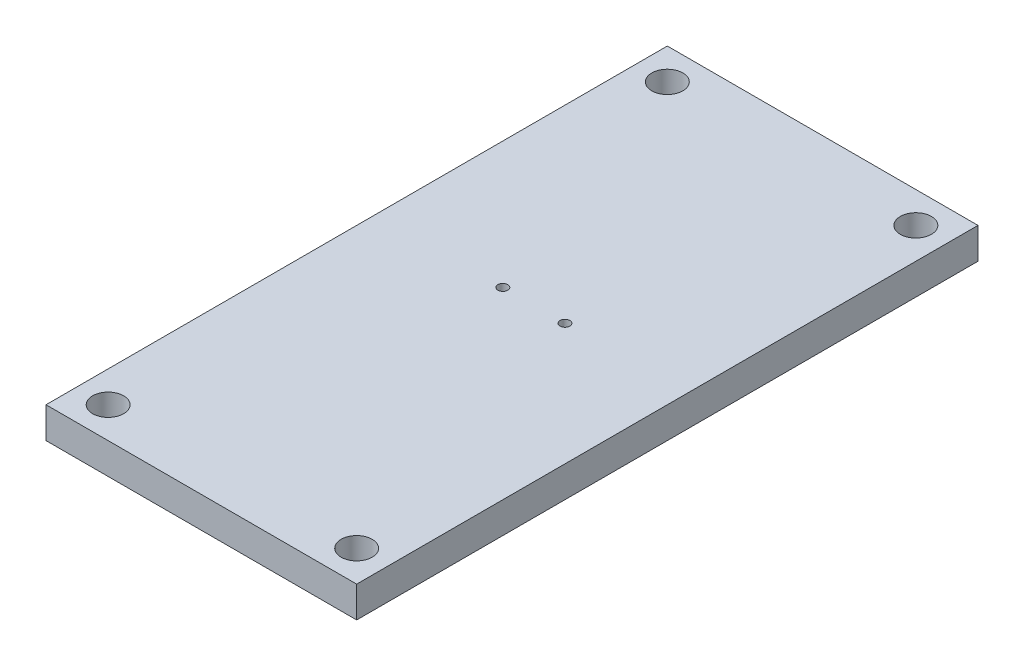
ISO-10303-21;
HEADER;
FILE_DESCRIPTION(('STEP AP214'),'2;1');
FILE_NAME('part.step','',(''),(''),'','','');
FILE_SCHEMA(('AUTOMOTIVE_DESIGN { 1 0 10303 214 1 1 1 1 }'));
ENDSEC;
DATA;
#1=APPLICATION_CONTEXT('core data for automotive mechanical design processes');
#2=APPLICATION_PROTOCOL_DEFINITION('international standard','automotive_design',2000,#1);
#3=PRODUCT_CONTEXT('',#1,'mechanical');
#4=PRODUCT('Part','Part','',(#3));
#5=PRODUCT_RELATED_PRODUCT_CATEGORY('part','',(#4));
#6=PRODUCT_DEFINITION_FORMATION('','',#4);
#7=PRODUCT_DEFINITION_CONTEXT('part definition',#1,'design');
#8=PRODUCT_DEFINITION('design','',#6,#7);
#9=PRODUCT_DEFINITION_SHAPE('','',#8);
#10=(LENGTH_UNIT() NAMED_UNIT(*) SI_UNIT(.MILLI.,.METRE.));
#11=(NAMED_UNIT(*) PLANE_ANGLE_UNIT() SI_UNIT($,.RADIAN.));
#12=(NAMED_UNIT(*) SI_UNIT($,.STERADIAN.) SOLID_ANGLE_UNIT());
#13=UNCERTAINTY_MEASURE_WITH_UNIT(LENGTH_MEASURE(1.E-05),#10,'distance_accuracy_value','');
#14=(GEOMETRIC_REPRESENTATION_CONTEXT(3) GLOBAL_UNCERTAINTY_ASSIGNED_CONTEXT((#13)) GLOBAL_UNIT_ASSIGNED_CONTEXT((#10,
#11,#12)) REPRESENTATION_CONTEXT('',''));
#15=CARTESIAN_POINT('',(0.,0.,0.));
#16=DIRECTION('',(0.,0.,1.));
#17=DIRECTION('',(1.,0.,0.));
#18=AXIS2_PLACEMENT_3D('',#15,#16,#17);
#19=CARTESIAN_POINT('',(-25.,5.,50.));
#20=DIRECTION('',(1.,0.,0.));
#21=DIRECTION('',(0.,0.,-1.));
#22=AXIS2_PLACEMENT_3D('',#19,#20,#21);
#23=PLANE('',#22);
#24=DIRECTION('',(0.,0.,1.));
#25=VECTOR('',#24,1.);
#26=CARTESIAN_POINT('',(-25.,0.,50.));
#27=LINE('',#26,#25);
#28=CARTESIAN_POINT('',(-25.,0.,-50.));
#29=VERTEX_POINT('',#28);
#30=CARTESIAN_POINT('',(-25.,0.,50.));
#31=VERTEX_POINT('',#30);
#32=EDGE_CURVE('E103',#29,#31,#27,.T.);
#33=ORIENTED_EDGE('',*,*,#32,.T.);
#34=DIRECTION('',(0.,-1.,0.));
#35=VECTOR('',#34,1.);
#36=CARTESIAN_POINT('',(-25.,5.,50.));
#37=LINE('',#36,#35);
#38=CARTESIAN_POINT('',(-25.,5.,50.));
#39=VERTEX_POINT('',#38);
#40=EDGE_CURVE('E11',#39,#31,#37,.T.);
#41=ORIENTED_EDGE('',*,*,#40,.F.);
#42=DIRECTION('',(0.,0.,1.));
#43=VECTOR('',#42,1.);
#44=CARTESIAN_POINT('',(-25.,5.,50.));
#45=LINE('',#44,#43);
#46=CARTESIAN_POINT('',(-25.,5.,-50.));
#47=VERTEX_POINT('',#46);
#48=EDGE_CURVE('E90',#47,#39,#45,.T.);
#49=ORIENTED_EDGE('',*,*,#48,.F.);
#50=DIRECTION('',(0.,-1.,0.));
#51=VECTOR('',#50,1.);
#52=CARTESIAN_POINT('',(-25.,5.,-50.));
#53=LINE('',#52,#51);
#54=EDGE_CURVE('E99',#47,#29,#53,.T.);
#55=ORIENTED_EDGE('',*,*,#54,.T.);
#56=EDGE_LOOP('',(#33,#41,#49,#55));
#57=FACE_BOUND('',#56,.T.);
#58=ADVANCED_FACE('F37',(#57),#23,.F.);
#59=CARTESIAN_POINT('',(25.,5.,50.));
#60=DIRECTION('',(0.,0.,-1.));
#61=DIRECTION('',(-1.,0.,0.));
#62=AXIS2_PLACEMENT_3D('',#59,#60,#61);
#63=PLANE('',#62);
#64=DIRECTION('',(1.,0.,0.));
#65=VECTOR('',#64,1.);
#66=CARTESIAN_POINT('',(25.,0.,50.));
#67=LINE('',#66,#65);
#68=CARTESIAN_POINT('',(25.,0.,50.));
#69=VERTEX_POINT('',#68);
#70=EDGE_CURVE('E94',#31,#69,#67,.T.);
#71=ORIENTED_EDGE('',*,*,#70,.T.);
#72=DIRECTION('',(0.,-1.,0.));
#73=VECTOR('',#72,1.);
#74=CARTESIAN_POINT('',(25.,5.,50.));
#75=LINE('',#74,#73);
#76=CARTESIAN_POINT('',(25.,5.,50.));
#77=VERTEX_POINT('',#76);
#78=EDGE_CURVE('E46',#77,#69,#75,.T.);
#79=ORIENTED_EDGE('',*,*,#78,.F.);
#80=DIRECTION('',(1.,0.,0.));
#81=VECTOR('',#80,1.);
#82=CARTESIAN_POINT('',(25.,5.,50.));
#83=LINE('',#82,#81);
#84=EDGE_CURVE('E85',#39,#77,#83,.T.);
#85=ORIENTED_EDGE('',*,*,#84,.F.);
#86=ORIENTED_EDGE('',*,*,#40,.T.);
#87=EDGE_LOOP('',(#71,#79,#85,#86));
#88=FACE_BOUND('',#87,.T.);
#89=ADVANCED_FACE('F93',(#88),#63,.F.);
#90=CARTESIAN_POINT('',(25.,5.,50.));
#91=DIRECTION('',(-1.,0.,0.));
#92=DIRECTION('',(0.,0.,1.));
#93=AXIS2_PLACEMENT_3D('',#90,#91,#92);
#94=PLANE('',#93);
#95=DIRECTION('',(0.,0.,-1.));
#96=VECTOR('',#95,1.);
#97=CARTESIAN_POINT('',(25.,0.,50.));
#98=LINE('',#97,#96);
#99=CARTESIAN_POINT('',(25.,0.,-50.));
#100=VERTEX_POINT('',#99);
#101=EDGE_CURVE('E72',#69,#100,#98,.T.);
#102=ORIENTED_EDGE('',*,*,#101,.T.);
#103=DIRECTION('',(0.,-1.,0.));
#104=VECTOR('',#103,1.);
#105=CARTESIAN_POINT('',(25.,5.,-50.));
#106=LINE('',#105,#104);
#107=CARTESIAN_POINT('',(25.,5.,-50.));
#108=VERTEX_POINT('',#107);
#109=EDGE_CURVE('E95',#108,#100,#106,.T.);
#110=ORIENTED_EDGE('',*,*,#109,.F.);
#111=DIRECTION('',(0.,0.,-1.));
#112=VECTOR('',#111,1.);
#113=CARTESIAN_POINT('',(25.,5.,50.));
#114=LINE('',#113,#112);
#115=EDGE_CURVE('E88',#77,#108,#114,.T.);
#116=ORIENTED_EDGE('',*,*,#115,.F.);
#117=ORIENTED_EDGE('',*,*,#78,.T.);
#118=EDGE_LOOP('',(#102,#110,#116,#117));
#119=FACE_BOUND('',#118,.T.);
#120=ADVANCED_FACE('F97',(#119),#94,.F.);
#121=CARTESIAN_POINT('',(25.,5.,-50.));
#122=DIRECTION('',(0.,0.,1.));
#123=DIRECTION('',(1.,0.,0.));
#124=AXIS2_PLACEMENT_3D('',#121,#122,#123);
#125=PLANE('',#124);
#126=DIRECTION('',(-1.,0.,0.));
#127=VECTOR('',#126,1.);
#128=CARTESIAN_POINT('',(25.,0.,-50.));
#129=LINE('',#128,#127);
#130=EDGE_CURVE('E78',#100,#29,#129,.T.);
#131=ORIENTED_EDGE('',*,*,#130,.T.);
#132=ORIENTED_EDGE('',*,*,#54,.F.);
#133=DIRECTION('',(-1.,0.,0.));
#134=VECTOR('',#133,1.);
#135=CARTESIAN_POINT('',(25.,5.,-50.));
#136=LINE('',#135,#134);
#137=EDGE_CURVE('E55',#108,#47,#136,.T.);
#138=ORIENTED_EDGE('',*,*,#137,.F.);
#139=ORIENTED_EDGE('',*,*,#109,.T.);
#140=EDGE_LOOP('',(#131,#132,#138,#139));
#141=FACE_BOUND('',#140,.T.);
#142=ADVANCED_FACE('F156',(#141),#125,.F.);
#143=CARTESIAN_POINT('',(0.,5.,0.));
#144=DIRECTION('',(0.,1.,0.));
#145=DIRECTION('',(0.,0.,1.));
#146=AXIS2_PLACEMENT_3D('',#143,#144,#145);
#147=PLANE('',#146);
#148=CARTESIAN_POINT('',(-20.,5.,-45.));
#149=DIRECTION('',(0.,-1.,0.));
#150=DIRECTION('',(0.,0.,1.));
#151=AXIS2_PLACEMENT_3D('',#148,#149,#150);
#152=CIRCLE('',#151,2.5);
#153=CARTESIAN_POINT('',(-20.,5.,-42.5));
#154=VERTEX_POINT('',#153);
#155=EDGE_CURVE('E284',#154,#154,#152,.T.);
#156=ORIENTED_EDGE('',*,*,#155,.T.);
#157=EDGE_LOOP('',(#156));
#158=FACE_BOUND('',#157,.T.);
#159=CARTESIAN_POINT('',(20.,5.,-45.));
#160=DIRECTION('',(0.,-1.,0.));
#161=DIRECTION('',(0.,0.,-1.));
#162=AXIS2_PLACEMENT_3D('',#159,#160,#161);
#163=CIRCLE('',#162,2.5);
#164=CARTESIAN_POINT('',(20.,5.,-47.5));
#165=VERTEX_POINT('',#164);
#166=EDGE_CURVE('E285',#165,#165,#163,.T.);
#167=ORIENTED_EDGE('',*,*,#166,.T.);
#168=EDGE_LOOP('',(#167));
#169=FACE_BOUND('',#168,.T.);
#170=CARTESIAN_POINT('',(20.,5.,45.));
#171=DIRECTION('',(0.,-1.,0.));
#172=DIRECTION('',(0.,0.,1.));
#173=AXIS2_PLACEMENT_3D('',#170,#171,#172);
#174=CIRCLE('',#173,2.5);
#175=CARTESIAN_POINT('',(20.,5.,47.5));
#176=VERTEX_POINT('',#175);
#177=EDGE_CURVE('E287',#176,#176,#174,.T.);
#178=ORIENTED_EDGE('',*,*,#177,.T.);
#179=EDGE_LOOP('',(#178));
#180=FACE_BOUND('',#179,.T.);
#181=CARTESIAN_POINT('',(-20.,5.,45.));
#182=DIRECTION('',(0.,-1.,0.));
#183=DIRECTION('',(0.,0.,-1.));
#184=AXIS2_PLACEMENT_3D('',#181,#182,#183);
#185=CIRCLE('',#184,2.5);
#186=CARTESIAN_POINT('',(-20.,5.,42.5));
#187=VERTEX_POINT('',#186);
#188=EDGE_CURVE('E120',#187,#187,#185,.T.);
#189=ORIENTED_EDGE('',*,*,#188,.T.);
#190=EDGE_LOOP('',(#189));
#191=FACE_BOUND('',#190,.T.);
#192=CARTESIAN_POINT('',(5.40885862110211,5.,-3.11604186050881));
#193=DIRECTION('',(0.,1.,0.));
#194=DIRECTION('',(0.,0.,1.));
#195=AXIS2_PLACEMENT_3D('',#192,#193,#194);
#196=CIRCLE('',#195,0.791259190515638);
#197=CARTESIAN_POINT('',(5.40885862110211,5.,-2.32478266999318));
#198=VERTEX_POINT('',#197);
#199=EDGE_CURVE('E115',#198,#198,#196,.T.);
#200=ORIENTED_EDGE('',*,*,#199,.F.);
#201=EDGE_LOOP('',(#200));
#202=FACE_BOUND('',#201,.T.);
#203=CARTESIAN_POINT('',(-4.59114137889789,5.,-3.1160418605088));
#204=DIRECTION('',(0.,1.,0.));
#205=DIRECTION('',(0.,0.,1.));
#206=AXIS2_PLACEMENT_3D('',#203,#204,#205);
#207=CIRCLE('',#206,0.791259190515638);
#208=CARTESIAN_POINT('',(-4.59114137889789,5.,-3.90730105102444));
#209=VERTEX_POINT('',#208);
#210=EDGE_CURVE('E106',#209,#209,#207,.F.);
#211=ORIENTED_EDGE('',*,*,#210,.T.);
#212=EDGE_LOOP('',(#211));
#213=FACE_BOUND('',#212,.T.);
#214=ORIENTED_EDGE('',*,*,#48,.T.);
#215=ORIENTED_EDGE('',*,*,#84,.T.);
#216=ORIENTED_EDGE('',*,*,#115,.T.);
#217=ORIENTED_EDGE('',*,*,#137,.T.);
#218=EDGE_LOOP('',(#214,#215,#216,#217));
#219=FACE_BOUND('',#218,.T.);
#220=ADVANCED_FACE('F86',(#158,#169,#180,#191,#202,#213,#219),#147,.T.);
#221=CARTESIAN_POINT('',(0.,0.,0.));
#222=DIRECTION('',(0.,1.,0.));
#223=DIRECTION('',(0.,0.,1.));
#224=AXIS2_PLACEMENT_3D('',#221,#222,#223);
#225=PLANE('',#224);
#226=CARTESIAN_POINT('',(-20.,0.,-45.));
#227=DIRECTION('',(0.,1.,0.));
#228=DIRECTION('',(0.,0.,1.));
#229=AXIS2_PLACEMENT_3D('',#226,#227,#228);
#230=CIRCLE('',#229,2.5);
#231=CARTESIAN_POINT('',(-20.,0.,-42.5));
#232=VERTEX_POINT('',#231);
#233=EDGE_CURVE('E40',#232,#232,#230,.T.);
#234=ORIENTED_EDGE('',*,*,#233,.T.);
#235=EDGE_LOOP('',(#234));
#236=FACE_BOUND('',#235,.T.);
#237=CARTESIAN_POINT('',(20.,0.,-45.));
#238=DIRECTION('',(0.,1.,0.));
#239=DIRECTION('',(0.,0.,1.));
#240=AXIS2_PLACEMENT_3D('',#237,#238,#239);
#241=CIRCLE('',#240,2.5);
#242=CARTESIAN_POINT('',(20.,0.,-42.5));
#243=VERTEX_POINT('',#242);
#244=EDGE_CURVE('E122',#243,#243,#241,.T.);
#245=ORIENTED_EDGE('',*,*,#244,.T.);
#246=EDGE_LOOP('',(#245));
#247=FACE_BOUND('',#246,.T.);
#248=CARTESIAN_POINT('',(20.,0.,45.));
#249=DIRECTION('',(0.,1.,0.));
#250=DIRECTION('',(0.,0.,1.));
#251=AXIS2_PLACEMENT_3D('',#248,#249,#250);
#252=CIRCLE('',#251,2.5);
#253=CARTESIAN_POINT('',(20.,0.,47.5));
#254=VERTEX_POINT('',#253);
#255=EDGE_CURVE('E119',#254,#254,#252,.T.);
#256=ORIENTED_EDGE('',*,*,#255,.T.);
#257=EDGE_LOOP('',(#256));
#258=FACE_BOUND('',#257,.T.);
#259=CARTESIAN_POINT('',(-20.,0.,45.));
#260=DIRECTION('',(0.,1.,0.));
#261=DIRECTION('',(0.,0.,1.));
#262=AXIS2_PLACEMENT_3D('',#259,#260,#261);
#263=CIRCLE('',#262,2.5);
#264=CARTESIAN_POINT('',(-20.,0.,47.5));
#265=VERTEX_POINT('',#264);
#266=EDGE_CURVE('E116',#265,#265,#263,.T.);
#267=ORIENTED_EDGE('',*,*,#266,.T.);
#268=EDGE_LOOP('',(#267));
#269=FACE_BOUND('',#268,.T.);
#270=CARTESIAN_POINT('',(5.40885862110211,0.,-3.11604186050881));
#271=DIRECTION('',(0.,1.,0.));
#272=DIRECTION('',(0.,0.,1.));
#273=AXIS2_PLACEMENT_3D('',#270,#271,#272);
#274=CIRCLE('',#273,0.791259190515638);
#275=CARTESIAN_POINT('',(5.40885862110211,0.,-2.32478266999318));
#276=VERTEX_POINT('',#275);
#277=EDGE_CURVE('E127',#276,#276,#274,.T.);
#278=ORIENTED_EDGE('',*,*,#277,.T.);
#279=EDGE_LOOP('',(#278));
#280=FACE_BOUND('',#279,.T.);
#281=CARTESIAN_POINT('',(-4.59114137889789,0.,-3.1160418605088));
#282=DIRECTION('',(0.,1.,0.));
#283=DIRECTION('',(0.,0.,1.));
#284=AXIS2_PLACEMENT_3D('',#281,#282,#283);
#285=CIRCLE('',#284,0.791259190515638);
#286=CARTESIAN_POINT('',(-4.59114137889789,0.,-3.90730105102444));
#287=VERTEX_POINT('',#286);
#288=EDGE_CURVE('E112',#287,#287,#285,.F.);
#289=ORIENTED_EDGE('',*,*,#288,.F.);
#290=EDGE_LOOP('',(#289));
#291=FACE_BOUND('',#290,.T.);
#292=ORIENTED_EDGE('',*,*,#32,.F.);
#293=ORIENTED_EDGE('',*,*,#130,.F.);
#294=ORIENTED_EDGE('',*,*,#101,.F.);
#295=ORIENTED_EDGE('',*,*,#70,.F.);
#296=EDGE_LOOP('',(#292,#293,#294,#295));
#297=FACE_BOUND('',#296,.T.);
#298=ADVANCED_FACE('F147',(#236,#247,#258,#269,#280,#291,#297),#225,.F.);
#299=CARTESIAN_POINT('',(-4.59114137889789,5.000012,-3.1160418605088));
#300=DIRECTION('',(0.,-1.,0.));
#301=DIRECTION('',(0.,0.,-1.));
#302=AXIS2_PLACEMENT_3D('',#299,#300,#301);
#303=CYLINDRICAL_SURFACE('',#302,0.791259190515638);
#304=CARTESIAN_POINT('',(-4.59114137889789,5.,-3.90730105102444));
#305=CARTESIAN_POINT('',(-4.59114137889789,4.94791666666667,-3.90730105102444));
#306=CARTESIAN_POINT('',(-4.59114137889789,4.89583333333333,-3.90730105102444));
#307=CARTESIAN_POINT('',(-4.59114137889789,4.79166666666667,-3.90730105102444));
#308=CARTESIAN_POINT('',(-4.59114137889789,4.73958333333333,-3.90730105102444));
#309=CARTESIAN_POINT('',(-4.59114137889789,4.63541666666667,-3.90730105102444));
#310=CARTESIAN_POINT('',(-4.59114137889789,4.58333333333333,-3.90730105102444));
#311=CARTESIAN_POINT('',(-4.59114137889789,4.47916666666667,-3.90730105102444));
#312=CARTESIAN_POINT('',(-4.59114137889789,4.42708333333333,-3.90730105102444));
#313=CARTESIAN_POINT('',(-4.59114137889789,4.32291666666667,-3.90730105102444));
#314=CARTESIAN_POINT('',(-4.59114137889789,4.27083333333333,-3.90730105102444));
#315=CARTESIAN_POINT('',(-4.59114137889789,4.16666666666667,-3.90730105102444));
#316=CARTESIAN_POINT('',(-4.59114137889789,4.11458333333333,-3.90730105102444));
#317=CARTESIAN_POINT('',(-4.59114137889789,4.01041666666667,-3.90730105102444));
#318=CARTESIAN_POINT('',(-4.59114137889789,3.95833333333333,-3.90730105102444));
#319=CARTESIAN_POINT('',(-4.59114137889789,3.85416666666667,-3.90730105102444));
#320=CARTESIAN_POINT('',(-4.59114137889789,3.80208333333333,-3.90730105102444));
#321=CARTESIAN_POINT('',(-4.59114137889789,3.69791666666667,-3.90730105102444));
#322=CARTESIAN_POINT('',(-4.59114137889789,3.64583333333333,-3.90730105102444));
#323=CARTESIAN_POINT('',(-4.59114137889789,3.54166666666667,-3.90730105102444));
#324=CARTESIAN_POINT('',(-4.59114137889789,3.48958333333333,-3.90730105102444));
#325=CARTESIAN_POINT('',(-4.59114137889789,3.38541666666667,-3.90730105102444));
#326=CARTESIAN_POINT('',(-4.59114137889789,3.33333333333333,-3.90730105102444));
#327=CARTESIAN_POINT('',(-4.59114137889789,3.22916666666667,-3.90730105102444));
#328=CARTESIAN_POINT('',(-4.59114137889789,3.17708333333333,-3.90730105102444));
#329=CARTESIAN_POINT('',(-4.59114137889789,3.07291666666667,-3.90730105102444));
#330=CARTESIAN_POINT('',(-4.59114137889789,3.02083333333333,-3.90730105102444));
#331=CARTESIAN_POINT('',(-4.59114137889789,2.91666666666667,-3.90730105102444));
#332=CARTESIAN_POINT('',(-4.59114137889789,2.86458333333333,-3.90730105102444));
#333=CARTESIAN_POINT('',(-4.59114137889789,2.76041666666667,-3.90730105102444));
#334=CARTESIAN_POINT('',(-4.59114137889789,2.70833333333333,-3.90730105102444));
#335=CARTESIAN_POINT('',(-4.59114137889789,2.60416666666667,-3.90730105102444));
#336=CARTESIAN_POINT('',(-4.59114137889789,2.55208333333333,-3.90730105102444));
#337=CARTESIAN_POINT('',(-4.59114137889789,2.44791666666667,-3.90730105102444));
#338=CARTESIAN_POINT('',(-4.59114137889789,2.39583333333333,-3.90730105102444));
#339=CARTESIAN_POINT('',(-4.59114137889789,2.29166666666667,-3.90730105102444));
#340=CARTESIAN_POINT('',(-4.59114137889789,2.23958333333333,-3.90730105102444));
#341=CARTESIAN_POINT('',(-4.59114137889789,2.13541666666667,-3.90730105102444));
#342=CARTESIAN_POINT('',(-4.59114137889789,2.08333333333333,-3.90730105102444));
#343=CARTESIAN_POINT('',(-4.59114137889789,1.97916666666667,-3.90730105102444));
#344=CARTESIAN_POINT('',(-4.59114137889789,1.92708333333333,-3.90730105102444));
#345=CARTESIAN_POINT('',(-4.59114137889789,1.82291666666667,-3.90730105102444));
#346=CARTESIAN_POINT('',(-4.59114137889789,1.77083333333333,-3.90730105102444));
#347=CARTESIAN_POINT('',(-4.59114137889789,1.66666666666667,-3.90730105102444));
#348=CARTESIAN_POINT('',(-4.59114137889789,1.61458333333333,-3.90730105102444));
#349=CARTESIAN_POINT('',(-4.59114137889789,1.51041666666667,-3.90730105102444));
#350=CARTESIAN_POINT('',(-4.59114137889789,1.45833333333333,-3.90730105102444));
#351=CARTESIAN_POINT('',(-4.59114137889789,1.35416666666667,-3.90730105102444));
#352=CARTESIAN_POINT('',(-4.59114137889789,1.30208333333333,-3.90730105102444));
#353=CARTESIAN_POINT('',(-4.59114137889789,1.19791666666667,-3.90730105102444));
#354=CARTESIAN_POINT('',(-4.59114137889789,1.14583333333333,-3.90730105102444));
#355=CARTESIAN_POINT('',(-4.59114137889789,1.04166666666667,-3.90730105102444));
#356=CARTESIAN_POINT('',(-4.59114137889789,0.989583333333333,-3.90730105102444));
#357=CARTESIAN_POINT('',(-4.59114137889789,0.885416666666667,-3.90730105102444));
#358=CARTESIAN_POINT('',(-4.59114137889789,0.833333333333333,-3.90730105102444));
#359=CARTESIAN_POINT('',(-4.59114137889789,0.729166666666667,-3.90730105102444));
#360=CARTESIAN_POINT('',(-4.59114137889789,0.677083333333333,-3.90730105102444));
#361=CARTESIAN_POINT('',(-4.59114137889789,0.572916666666666,-3.90730105102444));
#362=CARTESIAN_POINT('',(-4.59114137889789,0.520833333333333,-3.90730105102444));
#363=CARTESIAN_POINT('',(-4.59114137889789,0.416666666666666,-3.90730105102444));
#364=CARTESIAN_POINT('',(-4.59114137889789,0.364583333333333,-3.90730105102444));
#365=CARTESIAN_POINT('',(-4.59114137889789,0.260416666666666,-3.90730105102444));
#366=CARTESIAN_POINT('',(-4.59114137889789,0.208333333333333,-3.90730105102444));
#367=CARTESIAN_POINT('',(-4.59114137889789,0.104166666666666,-3.90730105102444));
#368=CARTESIAN_POINT('',(-4.59114137889789,0.0520833333333326,-3.90730105102444));
#369=CARTESIAN_POINT('',(-4.59114137889789,0.,-3.90730105102444));
#370=B_SPLINE_CURVE_WITH_KNOTS('',3,(#304,#305,#306,#307,#308,#309,#310,#311,#312,#313,#314,
#315,#316,#317,#318,#319,#320,#321,#322,#323,#324,#325,#326,#327,#328,#329,#330,#331,#332,#333,
#334,#335,#336,#337,#338,#339,#340,#341,#342,#343,#344,#345,#346,#347,#348,#349,#350,#351,#352,
#353,#354,#355,#356,#357,#358,#359,#360,#361,#362,#363,#364,#365,#366,#367,#368,#369),
.UNSPECIFIED.,.F.,.F.,(4,2,2,2,2,2,2,2,2,2,2,2,2,2,2,2,2,2,2,2,2,2,2,2,2,2,2,2,2,2,2,2,4),(0.,
0.15625,0.3125,0.46875,0.625000000000001,0.781250000000001,0.937500000000001,1.09375,1.25,
1.40625,1.5625,1.71875,1.875,2.03125,2.1875,2.34375,2.5,2.65625,2.8125,2.96875,3.125,3.28125,
3.4375,3.59375,3.75,3.90625,4.0625,4.21875,4.375,4.53125,4.6875,4.84375,5.),.UNSPECIFIED.);
#371=EDGE_CURVE('BSEAM143',#209,#287,#370,.T.);
#372=ORIENTED_EDGE('',*,*,#210,.F.);
#373=ORIENTED_EDGE('',*,*,#288,.T.);
#374=ORIENTED_EDGE('',*,*,#371,.T.);
#375=ORIENTED_EDGE('',*,*,#371,.F.);
#376=EDGE_LOOP('',(#372,#374,#373,#375));
#377=FACE_BOUND('',#376,.T.);
#378=ADVANCED_FACE('F143',(#377),#303,.F.);
#379=CARTESIAN_POINT('',(5.40885862110211,0.,-3.11604186050881));
#380=DIRECTION('',(0.,1.,0.));
#381=DIRECTION('',(0.,0.,1.));
#382=AXIS2_PLACEMENT_3D('',#379,#380,#381);
#383=CYLINDRICAL_SURFACE('',#382,0.791259190515638);
#384=ORIENTED_EDGE('',*,*,#199,.T.);
#385=EDGE_LOOP('',(#384));
#386=FACE_BOUND('',#385,.T.);
#387=ORIENTED_EDGE('',*,*,#277,.F.);
#388=EDGE_LOOP('',(#387));
#389=FACE_BOUND('',#388,.T.);
#390=ADVANCED_FACE('F146',(#386,#389),#383,.F.);
#391=CARTESIAN_POINT('',(-20.,5.,45.));
#392=DIRECTION('',(0.,-1.,0.));
#393=DIRECTION('',(0.,0.,-1.));
#394=AXIS2_PLACEMENT_3D('',#391,#392,#393);
#395=CYLINDRICAL_SURFACE('',#394,2.5);
#396=ORIENTED_EDGE('',*,*,#188,.F.);
#397=EDGE_LOOP('',(#396));
#398=FACE_BOUND('',#397,.T.);
#399=ORIENTED_EDGE('',*,*,#266,.F.);
#400=EDGE_LOOP('',(#399));
#401=FACE_BOUND('',#400,.T.);
#402=ADVANCED_FACE('F200',(#398,#401),#395,.F.);
#403=CARTESIAN_POINT('',(20.,5.,45.));
#404=DIRECTION('',(0.,-1.,0.));
#405=DIRECTION('',(0.,0.,-1.));
#406=AXIS2_PLACEMENT_3D('',#403,#404,#405);
#407=CYLINDRICAL_SURFACE('',#406,2.5);
#408=ORIENTED_EDGE('',*,*,#177,.F.);
#409=EDGE_LOOP('',(#408));
#410=FACE_BOUND('',#409,.T.);
#411=ORIENTED_EDGE('',*,*,#255,.F.);
#412=EDGE_LOOP('',(#411));
#413=FACE_BOUND('',#412,.T.);
#414=ADVANCED_FACE('F223',(#410,#413),#407,.F.);
#415=CARTESIAN_POINT('',(20.,5.,-45.));
#416=DIRECTION('',(0.,-1.,0.));
#417=DIRECTION('',(0.,0.,-1.));
#418=AXIS2_PLACEMENT_3D('',#415,#416,#417);
#419=CYLINDRICAL_SURFACE('',#418,2.5);
#420=ORIENTED_EDGE('',*,*,#166,.F.);
#421=EDGE_LOOP('',(#420));
#422=FACE_BOUND('',#421,.T.);
#423=ORIENTED_EDGE('',*,*,#244,.F.);
#424=EDGE_LOOP('',(#423));
#425=FACE_BOUND('',#424,.T.);
#426=ADVANCED_FACE('F234',(#422,#425),#419,.F.);
#427=CARTESIAN_POINT('',(-20.,5.,-45.));
#428=DIRECTION('',(0.,-1.,0.));
#429=DIRECTION('',(0.,0.,-1.));
#430=AXIS2_PLACEMENT_3D('',#427,#428,#429);
#431=CYLINDRICAL_SURFACE('',#430,2.5);
#432=ORIENTED_EDGE('',*,*,#155,.F.);
#433=EDGE_LOOP('',(#432));
#434=FACE_BOUND('',#433,.T.);
#435=ORIENTED_EDGE('',*,*,#233,.F.);
#436=EDGE_LOOP('',(#435));
#437=FACE_BOUND('',#436,.T.);
#438=ADVANCED_FACE('F245',(#434,#437),#431,.F.);
#439=CLOSED_SHELL('',(#58,#89,#120,#142,#220,#298,#378,#390,#402,#414,#426,#438));
#440=MANIFOLD_SOLID_BREP('B2',#439);
#441=ADVANCED_BREP_SHAPE_REPRESENTATION('',(#18,#440),#14);
#442=SHAPE_DEFINITION_REPRESENTATION(#9,#441);
ENDSEC;
END-ISO-10303-21;
